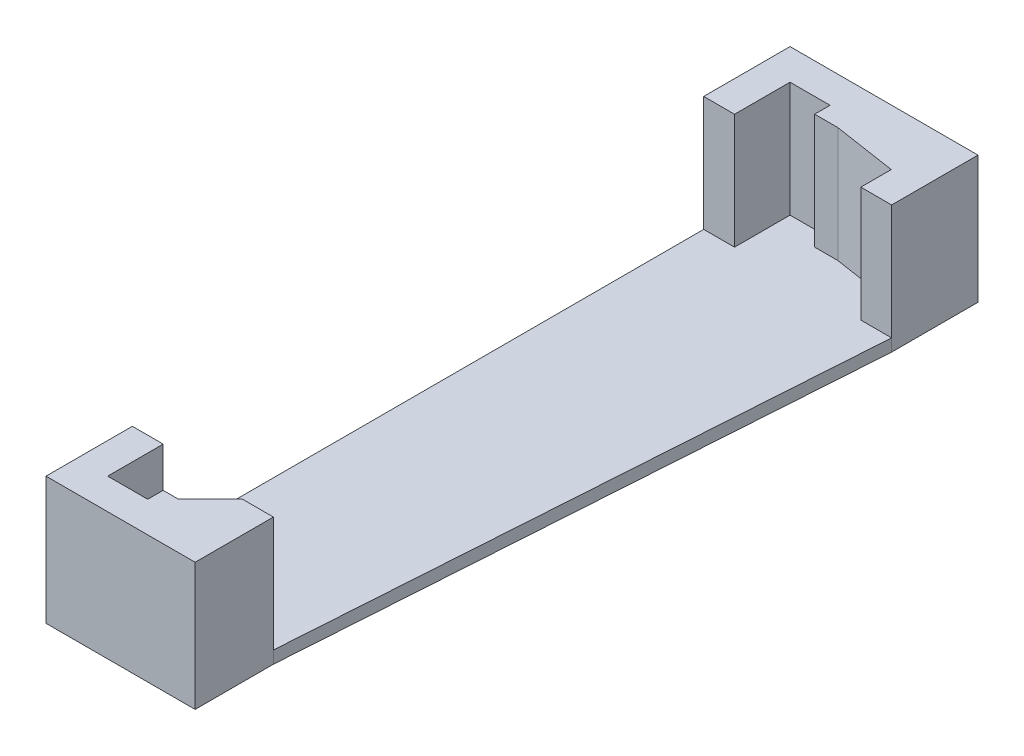
ISO-10303-21;
HEADER;
FILE_DESCRIPTION(('STEP AP214'),'2;1');
FILE_NAME('part.step','',(''),(''),'','','');
FILE_SCHEMA(('AUTOMOTIVE_DESIGN { 1 0 10303 214 1 1 1 1 }'));
ENDSEC;
DATA;
#1=APPLICATION_CONTEXT('core data for automotive mechanical design processes');
#2=APPLICATION_PROTOCOL_DEFINITION('international standard','automotive_design',2000,#1);
#3=PRODUCT_CONTEXT('',#1,'mechanical');
#4=PRODUCT('Part','Part','',(#3));
#5=PRODUCT_RELATED_PRODUCT_CATEGORY('part','',(#4));
#6=PRODUCT_DEFINITION_FORMATION('','',#4);
#7=PRODUCT_DEFINITION_CONTEXT('part definition',#1,'design');
#8=PRODUCT_DEFINITION('design','',#6,#7);
#9=PRODUCT_DEFINITION_SHAPE('','',#8);
#10=(LENGTH_UNIT() NAMED_UNIT(*) SI_UNIT(.MILLI.,.METRE.));
#11=(NAMED_UNIT(*) PLANE_ANGLE_UNIT() SI_UNIT($,.RADIAN.));
#12=(NAMED_UNIT(*) SI_UNIT($,.STERADIAN.) SOLID_ANGLE_UNIT());
#13=UNCERTAINTY_MEASURE_WITH_UNIT(LENGTH_MEASURE(1.E-05),#10,'distance_accuracy_value','');
#14=(GEOMETRIC_REPRESENTATION_CONTEXT(3) GLOBAL_UNCERTAINTY_ASSIGNED_CONTEXT((#13)) GLOBAL_UNIT_ASSIGNED_CONTEXT((#10,
#11,#12)) REPRESENTATION_CONTEXT('',''));
#15=CARTESIAN_POINT('',(0.,0.,0.));
#16=DIRECTION('',(0.,0.,1.));
#17=DIRECTION('',(1.,0.,0.));
#18=AXIS2_PLACEMENT_3D('',#15,#16,#17);
#19=CARTESIAN_POINT('',(0.,2.54,0.));
#20=DIRECTION('',(1.,0.,0.));
#21=DIRECTION('',(0.,0.,-1.));
#22=AXIS2_PLACEMENT_3D('',#19,#20,#21);
#23=PLANE('',#22);
#24=DIRECTION('',(0.,0.,1.));
#25=VECTOR('',#24,1.);
#26=CARTESIAN_POINT('',(0.,0.,0.));
#27=LINE('',#26,#25);
#28=CARTESIAN_POINT('',(0.,0.,-153.19375));
#29=VERTEX_POINT('',#28);
#30=CARTESIAN_POINT('',(0.,0.,0.));
#31=VERTEX_POINT('',#30);
#32=EDGE_CURVE('E211',#29,#31,#27,.T.);
#33=ORIENTED_EDGE('',*,*,#32,.T.);
#34=DIRECTION('',(0.,-1.,0.));
#35=VECTOR('',#34,1.);
#36=CARTESIAN_POINT('',(0.,2.54,0.));
#37=LINE('',#36,#35);
#38=CARTESIAN_POINT('',(0.,26.246666582,0.));
#39=VERTEX_POINT('',#38);
#40=EDGE_CURVE('E11',#39,#31,#37,.T.);
#41=ORIENTED_EDGE('',*,*,#40,.F.);
#42=DIRECTION('',(0.,0.,1.));
#43=VECTOR('',#42,1.);
#44=CARTESIAN_POINT('',(0.,26.246666582,0.));
#45=LINE('',#44,#43);
#46=CARTESIAN_POINT('',(0.,26.246666582,-17.78));
#47=VERTEX_POINT('',#46);
#48=EDGE_CURVE('E316',#47,#39,#45,.T.);
#49=ORIENTED_EDGE('',*,*,#48,.F.);
#50=DIRECTION('',(0.,-1.,0.));
#51=VECTOR('',#50,1.);
#52=CARTESIAN_POINT('',(0.,26.246666582,-17.78));
#53=LINE('',#52,#51);
#54=CARTESIAN_POINT('',(0.,2.54,-17.78));
#55=VERTEX_POINT('',#54);
#56=EDGE_CURVE('E197',#47,#55,#53,.T.);
#57=ORIENTED_EDGE('',*,*,#56,.T.);
#58=DIRECTION('',(0.,0.,1.));
#59=VECTOR('',#58,1.);
#60=CARTESIAN_POINT('',(0.,2.54,0.));
#61=LINE('',#60,#59);
#62=CARTESIAN_POINT('',(0.,2.54,-135.41375));
#63=VERTEX_POINT('',#62);
#64=EDGE_CURVE('E220',#63,#55,#61,.T.);
#65=ORIENTED_EDGE('',*,*,#64,.F.);
#66=DIRECTION('',(0.,-1.,0.));
#67=VECTOR('',#66,1.);
#68=CARTESIAN_POINT('',(0.,26.246666582,-135.41375));
#69=LINE('',#68,#67);
#70=CARTESIAN_POINT('',(0.,26.246666582,-135.41375));
#71=VERTEX_POINT('',#70);
#72=EDGE_CURVE('E244',#71,#63,#69,.T.);
#73=ORIENTED_EDGE('',*,*,#72,.F.);
#74=DIRECTION('',(0.,0.,1.));
#75=VECTOR('',#74,1.);
#76=CARTESIAN_POINT('',(0.,26.246666582,0.));
#77=LINE('',#76,#75);
#78=CARTESIAN_POINT('',(0.,26.246666582,-153.19375));
#79=VERTEX_POINT('',#78);
#80=EDGE_CURVE('E238',#79,#71,#77,.T.);
#81=ORIENTED_EDGE('',*,*,#80,.F.);
#82=DIRECTION('',(0.,-1.,0.));
#83=VECTOR('',#82,1.);
#84=CARTESIAN_POINT('',(0.,2.54,-153.19375));
#85=LINE('',#84,#83);
#86=EDGE_CURVE('E221',#79,#29,#85,.T.);
#87=ORIENTED_EDGE('',*,*,#86,.T.);
#88=EDGE_LOOP('',(#33,#41,#49,#57,#65,#73,#81,#87));
#89=FACE_BOUND('',#88,.T.);
#90=ADVANCED_FACE('F37',(#89),#23,.F.);
#91=CARTESIAN_POINT('',(0.,2.54,0.));
#92=DIRECTION('',(0.,0.,-1.));
#93=DIRECTION('',(-1.,0.,0.));
#94=AXIS2_PLACEMENT_3D('',#91,#92,#93);
#95=PLANE('',#94);
#96=DIRECTION('',(1.,0.,0.));
#97=VECTOR('',#96,1.);
#98=CARTESIAN_POINT('',(0.,0.,0.));
#99=LINE('',#98,#97);
#100=CARTESIAN_POINT('',(30.7032396375171,0.,0.));
#101=VERTEX_POINT('',#100);
#102=EDGE_CURVE('E203',#31,#101,#99,.T.);
#103=ORIENTED_EDGE('',*,*,#102,.T.);
#104=DIRECTION('',(0.,-1.,0.));
#105=VECTOR('',#104,1.);
#106=CARTESIAN_POINT('',(30.7032396375171,26.246666582,0.));
#107=LINE('',#106,#105);
#108=CARTESIAN_POINT('',(30.7032396375171,26.246666582,0.));
#109=VERTEX_POINT('',#108);
#110=EDGE_CURVE('E186',#109,#101,#107,.T.);
#111=ORIENTED_EDGE('',*,*,#110,.F.);
#112=DIRECTION('',(1.,0.,0.));
#113=VECTOR('',#112,1.);
#114=CARTESIAN_POINT('',(0.,26.246666582,0.));
#115=LINE('',#114,#113);
#116=EDGE_CURVE('E318',#39,#109,#115,.T.);
#117=ORIENTED_EDGE('',*,*,#116,.F.);
#118=ORIENTED_EDGE('',*,*,#40,.T.);
#119=EDGE_LOOP('',(#103,#111,#117,#118));
#120=FACE_BOUND('',#119,.T.);
#121=ADVANCED_FACE('F208',(#120),#95,.F.);
#122=CARTESIAN_POINT('',(38.699948,2.54,0.));
#123=DIRECTION('',(-1.,0.,0.));
#124=DIRECTION('',(0.,0.,1.));
#125=AXIS2_PLACEMENT_3D('',#122,#123,#124);
#126=PLANE('',#125);
#127=DIRECTION('',(0.,-1.,0.));
#128=VECTOR('',#127,1.);
#129=CARTESIAN_POINT('',(38.699948,26.246666582,-135.41375));
#130=LINE('',#129,#128);
#131=CARTESIAN_POINT('',(38.699948,26.246666582,-135.41375));
#132=VERTEX_POINT('',#131);
#133=CARTESIAN_POINT('',(38.699948,2.54,-135.41375));
#134=VERTEX_POINT('',#133);
#135=EDGE_CURVE('E273',#132,#134,#130,.T.);
#136=ORIENTED_EDGE('',*,*,#135,.T.);
#137=DIRECTION('',(0.,1.,0.));
#138=VECTOR('',#137,1.);
#139=CARTESIAN_POINT('',(38.699948,0.,-135.41375));
#140=LINE('',#139,#138);
#141=CARTESIAN_POINT('',(38.699948,0.,-135.41375));
#142=VERTEX_POINT('',#141);
#143=EDGE_CURVE('E390',#142,#134,#140,.T.);
#144=ORIENTED_EDGE('',*,*,#143,.F.);
#145=DIRECTION('',(0.,0.,-1.));
#146=VECTOR('',#145,1.);
#147=CARTESIAN_POINT('',(38.699948,0.,0.));
#148=LINE('',#147,#146);
#149=CARTESIAN_POINT('',(38.699948,0.,-153.19375));
#150=VERTEX_POINT('',#149);
#151=EDGE_CURVE('E210',#142,#150,#148,.T.);
#152=ORIENTED_EDGE('',*,*,#151,.T.);
#153=DIRECTION('',(0.,-1.,0.));
#154=VECTOR('',#153,1.);
#155=CARTESIAN_POINT('',(38.699948,2.54,-153.19375));
#156=LINE('',#155,#154);
#157=CARTESIAN_POINT('',(38.699948,26.246666582,-153.19375));
#158=VERTEX_POINT('',#157);
#159=EDGE_CURVE('E44',#158,#150,#156,.T.);
#160=ORIENTED_EDGE('',*,*,#159,.F.);
#161=DIRECTION('',(0.,0.,-1.));
#162=VECTOR('',#161,1.);
#163=CARTESIAN_POINT('',(38.699948,26.246666582,0.));
#164=LINE('',#163,#162);
#165=EDGE_CURVE('E242',#132,#158,#164,.T.);
#166=ORIENTED_EDGE('',*,*,#165,.F.);
#167=EDGE_LOOP('',(#136,#144,#152,#160,#166));
#168=FACE_BOUND('',#167,.T.);
#169=ADVANCED_FACE('F418',(#168),#126,.F.);
#170=CARTESIAN_POINT('',(0.,2.54,-153.19375));
#171=DIRECTION('',(0.,0.,1.));
#172=DIRECTION('',(1.,0.,0.));
#173=AXIS2_PLACEMENT_3D('',#170,#171,#172);
#174=PLANE('',#173);
#175=DIRECTION('',(-1.,0.,0.));
#176=VECTOR('',#175,1.);
#177=CARTESIAN_POINT('',(0.,0.,-153.19375));
#178=LINE('',#177,#176);
#179=EDGE_CURVE('E213',#150,#29,#178,.T.);
#180=ORIENTED_EDGE('',*,*,#179,.T.);
#181=ORIENTED_EDGE('',*,*,#86,.F.);
#182=DIRECTION('',(-1.,0.,0.));
#183=VECTOR('',#182,1.);
#184=CARTESIAN_POINT('',(0.,26.246666582,-153.19375));
#185=LINE('',#184,#183);
#186=EDGE_CURVE('E229',#158,#79,#185,.T.);
#187=ORIENTED_EDGE('',*,*,#186,.F.);
#188=ORIENTED_EDGE('',*,*,#159,.T.);
#189=EDGE_LOOP('',(#180,#181,#187,#188));
#190=FACE_BOUND('',#189,.T.);
#191=ADVANCED_FACE('F227',(#190),#174,.F.);
#192=CARTESIAN_POINT('',(0.,2.54,0.));
#193=DIRECTION('',(0.,-1.,0.));
#194=DIRECTION('',(0.,0.,-1.));
#195=AXIS2_PLACEMENT_3D('',#192,#193,#194);
#196=PLANE('',#195);
#197=DIRECTION('',(1.,0.,0.));
#198=VECTOR('',#197,1.);
#199=CARTESIAN_POINT('',(0.,2.54,-16.1157396375171));
#200=LINE('',#199,#198);
#201=CARTESIAN_POINT('',(24.3532396375171,2.54,-16.1157396375171));
#202=VERTEX_POINT('',#201);
#203=CARTESIAN_POINT('',(30.7032396375171,2.54,-16.1157396375171));
#204=VERTEX_POINT('',#203);
#205=EDGE_CURVE('E295',#202,#204,#200,.T.);
#206=ORIENTED_EDGE('',*,*,#205,.T.);
#207=DIRECTION('',(-0.0668812768469019,0.,0.997760940710413));
#208=VECTOR('',#207,1.);
#209=CARTESIAN_POINT('',(38.699948,2.54,-135.41375));
#210=LINE('',#209,#208);
#211=EDGE_CURVE('E206',#134,#204,#210,.T.);
#212=ORIENTED_EDGE('',*,*,#211,.F.);
#213=DIRECTION('',(1.,0.,0.));
#214=VECTOR('',#213,1.);
#215=CARTESIAN_POINT('',(0.,2.54,-135.41375));
#216=LINE('',#215,#214);
#217=CARTESIAN_POINT('',(32.35,2.54,-135.41375));
#218=VERTEX_POINT('',#217);
#219=EDGE_CURVE('E267',#218,#134,#216,.T.);
#220=ORIENTED_EDGE('',*,*,#219,.F.);
#221=DIRECTION('',(0.,0.,1.));
#222=VECTOR('',#221,1.);
#223=CARTESIAN_POINT('',(32.35,2.54,0.));
#224=LINE('',#223,#222);
#225=CARTESIAN_POINT('',(32.35,2.54,-141.684375));
#226=VERTEX_POINT('',#225);
#227=EDGE_CURVE('E264',#226,#218,#224,.T.);
#228=ORIENTED_EDGE('',*,*,#227,.F.);
#229=DIRECTION('',(0.988549583608947,0.,0.150896390767232));
#230=VECTOR('',#229,1.);
#231=CARTESIAN_POINT('',(21.8714552631246,2.54,-143.283864400941));
#232=LINE('',#231,#230);
#233=CARTESIAN_POINT('',(19.3499999999998,2.54,-143.66875));
#234=VERTEX_POINT('',#233);
#235=EDGE_CURVE('E261',#234,#226,#232,.T.);
#236=ORIENTED_EDGE('',*,*,#235,.F.);
#237=DIRECTION('',(1.,0.,0.));
#238=VECTOR('',#237,1.);
#239=CARTESIAN_POINT('',(0.,2.54,-143.66875));
#240=LINE('',#239,#238);
#241=CARTESIAN_POINT('',(14.5875,2.54,-143.66875));
#242=VERTEX_POINT('',#241);
#243=EDGE_CURVE('E258',#242,#234,#240,.T.);
#244=ORIENTED_EDGE('',*,*,#243,.F.);
#245=DIRECTION('',(0.,0.,1.));
#246=VECTOR('',#245,1.);
#247=CARTESIAN_POINT('',(14.5875,2.54,0.));
#248=LINE('',#247,#246);
#249=CARTESIAN_POINT('',(14.5875,2.54,-146.84375));
#250=VERTEX_POINT('',#249);
#251=EDGE_CURVE('E255',#250,#242,#248,.T.);
#252=ORIENTED_EDGE('',*,*,#251,.F.);
#253=DIRECTION('',(-1.,0.,0.));
#254=VECTOR('',#253,1.);
#255=CARTESIAN_POINT('',(0.,2.54,-146.84375));
#256=LINE('',#255,#254);
#257=CARTESIAN_POINT('',(6.34999999999997,2.54,-146.84375));
#258=VERTEX_POINT('',#257);
#259=EDGE_CURVE('E56',#250,#258,#256,.T.);
#260=ORIENTED_EDGE('',*,*,#259,.T.);
#261=DIRECTION('',(0.,0.,1.));
#262=VECTOR('',#261,1.);
#263=CARTESIAN_POINT('',(6.35,2.54,0.));
#264=LINE('',#263,#262);
#265=CARTESIAN_POINT('',(6.34999999999997,2.54,-135.41375));
#266=VERTEX_POINT('',#265);
#267=EDGE_CURVE('E51',#258,#266,#264,.T.);
#268=ORIENTED_EDGE('',*,*,#267,.T.);
#269=DIRECTION('',(-1.,0.,0.));
#270=VECTOR('',#269,1.);
#271=CARTESIAN_POINT('',(0.,2.54,-135.41375));
#272=LINE('',#271,#270);
#273=EDGE_CURVE('E250',#266,#63,#272,.T.);
#274=ORIENTED_EDGE('',*,*,#273,.T.);
#275=ORIENTED_EDGE('',*,*,#64,.T.);
#276=DIRECTION('',(-1.,0.,0.));
#277=VECTOR('',#276,1.);
#278=CARTESIAN_POINT('',(0.,2.54,-17.78));
#279=LINE('',#278,#277);
#280=CARTESIAN_POINT('',(6.34999999999997,2.54,-17.78));
#281=VERTEX_POINT('',#280);
#282=EDGE_CURVE('E300',#281,#55,#279,.T.);
#283=ORIENTED_EDGE('',*,*,#282,.F.);
#284=DIRECTION('',(0.,0.,-1.));
#285=VECTOR('',#284,1.);
#286=CARTESIAN_POINT('',(6.34999999999997,2.54,0.));
#287=LINE('',#286,#285);
#288=CARTESIAN_POINT('',(6.34999999999997,2.54,-6.34999999999999));
#289=VERTEX_POINT('',#288);
#290=EDGE_CURVE('E335',#289,#281,#287,.T.);
#291=ORIENTED_EDGE('',*,*,#290,.F.);
#292=DIRECTION('',(1.,0.,0.));
#293=VECTOR('',#292,1.);
#294=CARTESIAN_POINT('',(0.,2.54,-6.34999999999999));
#295=LINE('',#294,#293);
#296=CARTESIAN_POINT('',(14.5875,2.54,-6.35));
#297=VERTEX_POINT('',#296);
#298=EDGE_CURVE('E332',#289,#297,#295,.T.);
#299=ORIENTED_EDGE('',*,*,#298,.T.);
#300=DIRECTION('',(0.,0.,-1.));
#301=VECTOR('',#300,1.);
#302=CARTESIAN_POINT('',(14.5875000000001,2.54,-1.5940333043031E-13));
#303=LINE('',#302,#301);
#304=CARTESIAN_POINT('',(14.5875,2.54,-9.52500000000001));
#305=VERTEX_POINT('',#304);
#306=EDGE_CURVE('E329',#297,#305,#303,.T.);
#307=ORIENTED_EDGE('',*,*,#306,.T.);
#308=DIRECTION('',(1.,0.,0.));
#309=VECTOR('',#308,1.);
#310=CARTESIAN_POINT('',(0.,2.54,-9.52500000000001));
#311=LINE('',#310,#309);
#312=CARTESIAN_POINT('',(17.7625,2.54,-9.52500000000001));
#313=VERTEX_POINT('',#312);
#314=EDGE_CURVE('E326',#305,#313,#311,.T.);
#315=ORIENTED_EDGE('',*,*,#314,.T.);
#316=DIRECTION('',(0.707106781186546,0.,-0.707106781186549));
#317=VECTOR('',#316,1.);
#318=CARTESIAN_POINT('',(4.11875000000001,2.54,4.11875));
#319=LINE('',#318,#317);
#320=EDGE_CURVE('E323',#313,#202,#319,.T.);
#321=ORIENTED_EDGE('',*,*,#320,.T.);
#322=EDGE_LOOP('',(#206,#212,#220,#228,#236,#244,#252,#260,#268,#274,#275,#283,#291,#299,#307,
#315,#321));
#323=FACE_BOUND('',#322,.T.);
#324=ADVANCED_FACE('F356',(#323),#196,.F.);
#325=CARTESIAN_POINT('',(0.,0.,0.));
#326=DIRECTION('',(0.,-1.,0.));
#327=DIRECTION('',(0.,0.,-1.));
#328=AXIS2_PLACEMENT_3D('',#325,#326,#327);
#329=PLANE('',#328);
#330=DIRECTION('',(0.,0.,1.));
#331=VECTOR('',#330,1.);
#332=CARTESIAN_POINT('',(30.7032396375171,0.,-16.1157396375171));
#333=LINE('',#332,#331);
#334=CARTESIAN_POINT('',(30.7032396375171,0.,-16.1157396375171));
#335=VERTEX_POINT('',#334);
#336=EDGE_CURVE('E190',#335,#101,#333,.T.);
#337=ORIENTED_EDGE('',*,*,#336,.T.);
#338=ORIENTED_EDGE('',*,*,#102,.F.);
#339=ORIENTED_EDGE('',*,*,#32,.F.);
#340=ORIENTED_EDGE('',*,*,#179,.F.);
#341=ORIENTED_EDGE('',*,*,#151,.F.);
#342=DIRECTION('',(-0.0668812768469019,0.,0.997760940710413));
#343=VECTOR('',#342,1.);
#344=CARTESIAN_POINT('',(38.699948,0.,-135.41375));
#345=LINE('',#344,#343);
#346=EDGE_CURVE('E205',#142,#335,#345,.T.);
#347=ORIENTED_EDGE('',*,*,#346,.T.);
#348=EDGE_LOOP('',(#337,#338,#339,#340,#341,#347));
#349=FACE_BOUND('',#348,.T.);
#350=ADVANCED_FACE('F201',(#349),#329,.T.);
#351=CARTESIAN_POINT('',(0.,26.246666582,-16.1157396375171));
#352=DIRECTION('',(0.,0.,-1.));
#353=DIRECTION('',(-1.,0.,0.));
#354=AXIS2_PLACEMENT_3D('',#351,#352,#353);
#355=PLANE('',#354);
#356=ORIENTED_EDGE('',*,*,#205,.F.);
#357=DIRECTION('',(0.,-1.,0.));
#358=VECTOR('',#357,1.);
#359=CARTESIAN_POINT('',(24.3532396375171,26.246666582,-16.1157396375171));
#360=LINE('',#359,#358);
#361=CARTESIAN_POINT('',(24.3532396375171,26.246666582,-16.1157396375171));
#362=VERTEX_POINT('',#361);
#363=EDGE_CURVE('E215',#362,#202,#360,.T.);
#364=ORIENTED_EDGE('',*,*,#363,.F.);
#365=DIRECTION('',(1.,0.,0.));
#366=VECTOR('',#365,1.);
#367=CARTESIAN_POINT('',(0.,26.246666582,-16.1157396375171));
#368=LINE('',#367,#366);
#369=CARTESIAN_POINT('',(30.7032396375171,26.246666582,-16.1157396375171));
#370=VERTEX_POINT('',#369);
#371=EDGE_CURVE('E296',#362,#370,#368,.T.);
#372=ORIENTED_EDGE('',*,*,#371,.T.);
#373=DIRECTION('',(0.,-1.,0.));
#374=VECTOR('',#373,1.);
#375=CARTESIAN_POINT('',(30.7032396375171,26.246666582,-16.1157396375171));
#376=LINE('',#375,#374);
#377=EDGE_CURVE('E198',#370,#204,#376,.T.);
#378=ORIENTED_EDGE('',*,*,#377,.T.);
#379=EDGE_LOOP('',(#356,#364,#372,#378));
#380=FACE_BOUND('',#379,.T.);
#381=ADVANCED_FACE('F388',(#380),#355,.T.);
#382=CARTESIAN_POINT('',(4.11875000000001,26.246666582,4.11875));
#383=DIRECTION('',(-0.707106781186549,0.,-0.707106781186546));
#384=DIRECTION('',(-0.707106781186546,0.,0.707106781186549));
#385=AXIS2_PLACEMENT_3D('',#382,#383,#384);
#386=PLANE('',#385);
#387=ORIENTED_EDGE('',*,*,#320,.F.);
#388=DIRECTION('',(0.,-1.,0.));
#389=VECTOR('',#388,1.);
#390=CARTESIAN_POINT('',(17.7625,26.246666582,-9.52500000000001));
#391=LINE('',#390,#389);
#392=CARTESIAN_POINT('',(17.7625,26.246666582,-9.52500000000001));
#393=VERTEX_POINT('',#392);
#394=EDGE_CURVE('E352',#393,#313,#391,.T.);
#395=ORIENTED_EDGE('',*,*,#394,.F.);
#396=DIRECTION('',(0.707106781186546,0.,-0.707106781186549));
#397=VECTOR('',#396,1.);
#398=CARTESIAN_POINT('',(4.11875000000001,26.246666582,4.11875));
#399=LINE('',#398,#397);
#400=EDGE_CURVE('E299',#393,#362,#399,.T.);
#401=ORIENTED_EDGE('',*,*,#400,.T.);
#402=ORIENTED_EDGE('',*,*,#363,.T.);
#403=EDGE_LOOP('',(#387,#395,#401,#402));
#404=FACE_BOUND('',#403,.T.);
#405=ADVANCED_FACE('F385',(#404),#386,.T.);
#406=CARTESIAN_POINT('',(0.,26.246666582,-9.52500000000001));
#407=DIRECTION('',(0.,0.,-1.));
#408=DIRECTION('',(-1.,0.,0.));
#409=AXIS2_PLACEMENT_3D('',#406,#407,#408);
#410=PLANE('',#409);
#411=ORIENTED_EDGE('',*,*,#314,.F.);
#412=DIRECTION('',(0.,-1.,0.));
#413=VECTOR('',#412,1.);
#414=CARTESIAN_POINT('',(14.5875,26.246666582,-9.52500000000001));
#415=LINE('',#414,#413);
#416=CARTESIAN_POINT('',(14.5875,26.246666582,-9.52500000000001));
#417=VERTEX_POINT('',#416);
#418=EDGE_CURVE('E350',#417,#305,#415,.T.);
#419=ORIENTED_EDGE('',*,*,#418,.F.);
#420=DIRECTION('',(1.,0.,0.));
#421=VECTOR('',#420,1.);
#422=CARTESIAN_POINT('',(0.,26.246666582,-9.52500000000001));
#423=LINE('',#422,#421);
#424=EDGE_CURVE('E303',#417,#393,#423,.T.);
#425=ORIENTED_EDGE('',*,*,#424,.T.);
#426=ORIENTED_EDGE('',*,*,#394,.T.);
#427=EDGE_LOOP('',(#411,#419,#425,#426));
#428=FACE_BOUND('',#427,.T.);
#429=ADVANCED_FACE('F381',(#428),#410,.T.);
#430=CARTESIAN_POINT('',(14.5875000000001,26.246666582,-1.5940333043031E-13));
#431=DIRECTION('',(-1.,0.,0.));
#432=DIRECTION('',(0.,0.,1.));
#433=AXIS2_PLACEMENT_3D('',#430,#431,#432);
#434=PLANE('',#433);
#435=ORIENTED_EDGE('',*,*,#306,.F.);
#436=DIRECTION('',(0.,-1.,0.));
#437=VECTOR('',#436,1.);
#438=CARTESIAN_POINT('',(14.5875,26.246666582,-6.35));
#439=LINE('',#438,#437);
#440=CARTESIAN_POINT('',(14.5875,26.246666582,-6.35));
#441=VERTEX_POINT('',#440);
#442=EDGE_CURVE('E348',#441,#297,#439,.T.);
#443=ORIENTED_EDGE('',*,*,#442,.F.);
#444=DIRECTION('',(0.,0.,-1.));
#445=VECTOR('',#444,1.);
#446=CARTESIAN_POINT('',(14.5875000000001,26.246666582,-1.5940333043031E-13));
#447=LINE('',#446,#445);
#448=EDGE_CURVE('E306',#441,#417,#447,.T.);
#449=ORIENTED_EDGE('',*,*,#448,.T.);
#450=ORIENTED_EDGE('',*,*,#418,.T.);
#451=EDGE_LOOP('',(#435,#443,#449,#450));
#452=FACE_BOUND('',#451,.T.);
#453=ADVANCED_FACE('F377',(#452),#434,.T.);
#454=CARTESIAN_POINT('',(0.,26.246666582,-6.34999999999999));
#455=DIRECTION('',(0.,0.,-1.));
#456=DIRECTION('',(-1.,0.,0.));
#457=AXIS2_PLACEMENT_3D('',#454,#455,#456);
#458=PLANE('',#457);
#459=ORIENTED_EDGE('',*,*,#298,.F.);
#460=DIRECTION('',(0.,-1.,0.));
#461=VECTOR('',#460,1.);
#462=CARTESIAN_POINT('',(6.34999999999997,26.246666582,-6.34999999999999));
#463=LINE('',#462,#461);
#464=CARTESIAN_POINT('',(6.34999999999997,26.246666582,-6.34999999999999));
#465=VERTEX_POINT('',#464);
#466=EDGE_CURVE('E346',#465,#289,#463,.T.);
#467=ORIENTED_EDGE('',*,*,#466,.F.);
#468=DIRECTION('',(1.,0.,0.));
#469=VECTOR('',#468,1.);
#470=CARTESIAN_POINT('',(0.,26.246666582,-6.34999999999999));
#471=LINE('',#470,#469);
#472=EDGE_CURVE('E309',#465,#441,#471,.T.);
#473=ORIENTED_EDGE('',*,*,#472,.T.);
#474=ORIENTED_EDGE('',*,*,#442,.T.);
#475=EDGE_LOOP('',(#459,#467,#473,#474));
#476=FACE_BOUND('',#475,.T.);
#477=ADVANCED_FACE('F375',(#476),#458,.T.);
#478=CARTESIAN_POINT('',(6.34999999999997,26.246666582,0.));
#479=DIRECTION('',(-1.,0.,0.));
#480=DIRECTION('',(0.,0.,1.));
#481=AXIS2_PLACEMENT_3D('',#478,#479,#480);
#482=PLANE('',#481);
#483=ORIENTED_EDGE('',*,*,#290,.T.);
#484=DIRECTION('',(0.,-1.,0.));
#485=VECTOR('',#484,1.);
#486=CARTESIAN_POINT('',(6.34999999999997,26.246666582,-17.78));
#487=LINE('',#486,#485);
#488=CARTESIAN_POINT('',(6.34999999999997,26.246666582,-17.78));
#489=VERTEX_POINT('',#488);
#490=EDGE_CURVE('E343',#489,#281,#487,.T.);
#491=ORIENTED_EDGE('',*,*,#490,.F.);
#492=DIRECTION('',(0.,0.,-1.));
#493=VECTOR('',#492,1.);
#494=CARTESIAN_POINT('',(6.34999999999997,26.246666582,0.));
#495=LINE('',#494,#493);
#496=EDGE_CURVE('E312',#465,#489,#495,.T.);
#497=ORIENTED_EDGE('',*,*,#496,.F.);
#498=ORIENTED_EDGE('',*,*,#466,.T.);
#499=EDGE_LOOP('',(#483,#491,#497,#498));
#500=FACE_BOUND('',#499,.T.);
#501=ADVANCED_FACE('F371',(#500),#482,.F.);
#502=CARTESIAN_POINT('',(0.,26.246666582,-17.78));
#503=DIRECTION('',(0.,0.,1.));
#504=DIRECTION('',(1.,0.,0.));
#505=AXIS2_PLACEMENT_3D('',#502,#503,#504);
#506=PLANE('',#505);
#507=ORIENTED_EDGE('',*,*,#282,.T.);
#508=ORIENTED_EDGE('',*,*,#56,.F.);
#509=DIRECTION('',(-1.,0.,0.));
#510=VECTOR('',#509,1.);
#511=CARTESIAN_POINT('',(0.,26.246666582,-17.78));
#512=LINE('',#511,#510);
#513=EDGE_CURVE('E314',#489,#47,#512,.T.);
#514=ORIENTED_EDGE('',*,*,#513,.F.);
#515=ORIENTED_EDGE('',*,*,#490,.T.);
#516=EDGE_LOOP('',(#507,#508,#514,#515));
#517=FACE_BOUND('',#516,.T.);
#518=ADVANCED_FACE('F361',(#517),#506,.F.);
#519=CARTESIAN_POINT('',(30.7032396375171,26.246666582,-1.25587903990613E-13));
#520=DIRECTION('',(1.,0.,0.));
#521=DIRECTION('',(0.,0.,-1.));
#522=AXIS2_PLACEMENT_3D('',#519,#520,#521);
#523=PLANE('',#522);
#524=ORIENTED_EDGE('',*,*,#110,.T.);
#525=ORIENTED_EDGE('',*,*,#336,.F.);
#526=DIRECTION('',(0.,1.,0.));
#527=VECTOR('',#526,1.);
#528=CARTESIAN_POINT('',(30.7032396375171,0.,-16.1157396375171));
#529=LINE('',#528,#527);
#530=EDGE_CURVE('E252',#335,#204,#529,.T.);
#531=ORIENTED_EDGE('',*,*,#530,.T.);
#532=ORIENTED_EDGE('',*,*,#377,.F.);
#533=DIRECTION('',(0.,0.,1.));
#534=VECTOR('',#533,1.);
#535=CARTESIAN_POINT('',(30.7032396375171,26.246666582,-1.25587903990613E-13));
#536=LINE('',#535,#534);
#537=EDGE_CURVE('E193',#370,#109,#536,.T.);
#538=ORIENTED_EDGE('',*,*,#537,.T.);
#539=EDGE_LOOP('',(#524,#525,#531,#532,#538));
#540=FACE_BOUND('',#539,.T.);
#541=ADVANCED_FACE('F188',(#540),#523,.T.);
#542=CARTESIAN_POINT('',(0.,26.246666582,0.));
#543=DIRECTION('',(0.,1.,0.));
#544=DIRECTION('',(0.,0.,1.));
#545=AXIS2_PLACEMENT_3D('',#542,#543,#544);
#546=PLANE('',#545);
#547=ORIENTED_EDGE('',*,*,#371,.F.);
#548=ORIENTED_EDGE('',*,*,#400,.F.);
#549=ORIENTED_EDGE('',*,*,#424,.F.);
#550=ORIENTED_EDGE('',*,*,#448,.F.);
#551=ORIENTED_EDGE('',*,*,#472,.F.);
#552=ORIENTED_EDGE('',*,*,#496,.T.);
#553=ORIENTED_EDGE('',*,*,#513,.T.);
#554=ORIENTED_EDGE('',*,*,#48,.T.);
#555=ORIENTED_EDGE('',*,*,#116,.T.);
#556=ORIENTED_EDGE('',*,*,#537,.F.);
#557=EDGE_LOOP('',(#547,#548,#549,#550,#551,#552,#553,#554,#555,#556));
#558=FACE_BOUND('',#557,.T.);
#559=ADVANCED_FACE('F366',(#558),#546,.T.);
#560=CARTESIAN_POINT('',(0.,26.246666582,-135.41375));
#561=DIRECTION('',(0.,0.,1.));
#562=DIRECTION('',(1.,0.,0.));
#563=AXIS2_PLACEMENT_3D('',#560,#561,#562);
#564=PLANE('',#563);
#565=ORIENTED_EDGE('',*,*,#273,.F.);
#566=DIRECTION('',(0.,-1.,0.));
#567=VECTOR('',#566,1.);
#568=CARTESIAN_POINT('',(6.34999999999997,26.246666582,-135.41375));
#569=LINE('',#568,#567);
#570=CARTESIAN_POINT('',(6.34999999999997,26.246666582,-135.41375));
#571=VERTEX_POINT('',#570);
#572=EDGE_CURVE('E293',#571,#266,#569,.T.);
#573=ORIENTED_EDGE('',*,*,#572,.F.);
#574=DIRECTION('',(-1.,0.,0.));
#575=VECTOR('',#574,1.);
#576=CARTESIAN_POINT('',(0.,26.246666582,-135.41375));
#577=LINE('',#576,#575);
#578=EDGE_CURVE('E270',#571,#71,#577,.T.);
#579=ORIENTED_EDGE('',*,*,#578,.T.);
#580=ORIENTED_EDGE('',*,*,#72,.T.);
#581=EDGE_LOOP('',(#565,#573,#579,#580));
#582=FACE_BOUND('',#581,.T.);
#583=ADVANCED_FACE('F535',(#582),#564,.T.);
#584=CARTESIAN_POINT('',(6.35,26.246666582,0.));
#585=DIRECTION('',(1.,0.,0.));
#586=DIRECTION('',(0.,0.,-1.));
#587=AXIS2_PLACEMENT_3D('',#584,#585,#586);
#588=PLANE('',#587);
#589=ORIENTED_EDGE('',*,*,#267,.F.);
#590=DIRECTION('',(0.,-1.,0.));
#591=VECTOR('',#590,1.);
#592=CARTESIAN_POINT('',(6.34999999999997,26.246666582,-146.84375));
#593=LINE('',#592,#591);
#594=CARTESIAN_POINT('',(6.34999999999997,26.246666582,-146.84375));
#595=VERTEX_POINT('',#594);
#596=EDGE_CURVE('E291',#595,#258,#593,.T.);
#597=ORIENTED_EDGE('',*,*,#596,.F.);
#598=DIRECTION('',(0.,0.,1.));
#599=VECTOR('',#598,1.);
#600=CARTESIAN_POINT('',(6.35,26.246666582,0.));
#601=LINE('',#600,#599);
#602=EDGE_CURVE('E398',#595,#571,#601,.T.);
#603=ORIENTED_EDGE('',*,*,#602,.T.);
#604=ORIENTED_EDGE('',*,*,#572,.T.);
#605=EDGE_LOOP('',(#589,#597,#603,#604));
#606=FACE_BOUND('',#605,.T.);
#607=ADVANCED_FACE('F531',(#606),#588,.T.);
#608=CARTESIAN_POINT('',(0.,26.246666582,-146.84375));
#609=DIRECTION('',(0.,0.,1.));
#610=DIRECTION('',(1.,0.,0.));
#611=AXIS2_PLACEMENT_3D('',#608,#609,#610);
#612=PLANE('',#611);
#613=ORIENTED_EDGE('',*,*,#259,.F.);
#614=DIRECTION('',(0.,-1.,0.));
#615=VECTOR('',#614,1.);
#616=CARTESIAN_POINT('',(14.5875,26.246666582,-146.84375));
#617=LINE('',#616,#615);
#618=CARTESIAN_POINT('',(14.5875,26.246666582,-146.84375));
#619=VERTEX_POINT('',#618);
#620=EDGE_CURVE('E288',#619,#250,#617,.T.);
#621=ORIENTED_EDGE('',*,*,#620,.F.);
#622=DIRECTION('',(-1.,0.,0.));
#623=VECTOR('',#622,1.);
#624=CARTESIAN_POINT('',(0.,26.246666582,-146.84375));
#625=LINE('',#624,#623);
#626=EDGE_CURVE('E401',#619,#595,#625,.T.);
#627=ORIENTED_EDGE('',*,*,#626,.T.);
#628=ORIENTED_EDGE('',*,*,#596,.T.);
#629=EDGE_LOOP('',(#613,#621,#627,#628));
#630=FACE_BOUND('',#629,.T.);
#631=ADVANCED_FACE('F527',(#630),#612,.T.);
#632=CARTESIAN_POINT('',(14.5875,26.246666582,0.));
#633=DIRECTION('',(1.,0.,0.));
#634=DIRECTION('',(0.,0.,-1.));
#635=AXIS2_PLACEMENT_3D('',#632,#633,#634);
#636=PLANE('',#635);
#637=ORIENTED_EDGE('',*,*,#251,.T.);
#638=DIRECTION('',(0.,-1.,0.));
#639=VECTOR('',#638,1.);
#640=CARTESIAN_POINT('',(14.5875,26.246666582,-143.66875));
#641=LINE('',#640,#639);
#642=CARTESIAN_POINT('',(14.5875,26.246666582,-143.66875));
#643=VERTEX_POINT('',#642);
#644=EDGE_CURVE('E285',#643,#242,#641,.T.);
#645=ORIENTED_EDGE('',*,*,#644,.F.);
#646=DIRECTION('',(0.,0.,1.));
#647=VECTOR('',#646,1.);
#648=CARTESIAN_POINT('',(14.5875,26.246666582,0.));
#649=LINE('',#648,#647);
#650=EDGE_CURVE('E404',#619,#643,#649,.T.);
#651=ORIENTED_EDGE('',*,*,#650,.F.);
#652=ORIENTED_EDGE('',*,*,#620,.T.);
#653=EDGE_LOOP('',(#637,#645,#651,#652));
#654=FACE_BOUND('',#653,.T.);
#655=ADVANCED_FACE('F523',(#654),#636,.F.);
#656=CARTESIAN_POINT('',(0.,26.246666582,-143.66875));
#657=DIRECTION('',(0.,0.,-1.));
#658=DIRECTION('',(-1.,0.,0.));
#659=AXIS2_PLACEMENT_3D('',#656,#657,#658);
#660=PLANE('',#659);
#661=ORIENTED_EDGE('',*,*,#243,.T.);
#662=DIRECTION('',(0.,-1.,0.));
#663=VECTOR('',#662,1.);
#664=CARTESIAN_POINT('',(19.3499999999998,26.246666582,-143.66875));
#665=LINE('',#664,#663);
#666=CARTESIAN_POINT('',(19.3499999999998,26.246666582,-143.66875));
#667=VERTEX_POINT('',#666);
#668=EDGE_CURVE('E282',#667,#234,#665,.T.);
#669=ORIENTED_EDGE('',*,*,#668,.F.);
#670=DIRECTION('',(1.,0.,0.));
#671=VECTOR('',#670,1.);
#672=CARTESIAN_POINT('',(0.,26.246666582,-143.66875));
#673=LINE('',#672,#671);
#674=EDGE_CURVE('E406',#643,#667,#673,.T.);
#675=ORIENTED_EDGE('',*,*,#674,.F.);
#676=ORIENTED_EDGE('',*,*,#644,.T.);
#677=EDGE_LOOP('',(#661,#669,#675,#676));
#678=FACE_BOUND('',#677,.T.);
#679=ADVANCED_FACE('F519',(#678),#660,.F.);
#680=CARTESIAN_POINT('',(21.8714552631246,26.246666582,-143.283864400941));
#681=DIRECTION('',(0.150896390767232,0.,-0.988549583608947));
#682=DIRECTION('',(-0.988549583608947,0.,-0.150896390767232));
#683=AXIS2_PLACEMENT_3D('',#680,#681,#682);
#684=PLANE('',#683);
#685=ORIENTED_EDGE('',*,*,#235,.T.);
#686=DIRECTION('',(0.,-1.,0.));
#687=VECTOR('',#686,1.);
#688=CARTESIAN_POINT('',(32.35,26.246666582,-141.684375));
#689=LINE('',#688,#687);
#690=CARTESIAN_POINT('',(32.35,26.246666582,-141.684375));
#691=VERTEX_POINT('',#690);
#692=EDGE_CURVE('E279',#691,#226,#689,.T.);
#693=ORIENTED_EDGE('',*,*,#692,.F.);
#694=DIRECTION('',(0.988549583608947,0.,0.150896390767232));
#695=VECTOR('',#694,1.);
#696=CARTESIAN_POINT('',(21.8714552631246,26.246666582,-143.283864400941));
#697=LINE('',#696,#695);
#698=EDGE_CURVE('E408',#667,#691,#697,.T.);
#699=ORIENTED_EDGE('',*,*,#698,.F.);
#700=ORIENTED_EDGE('',*,*,#668,.T.);
#701=EDGE_LOOP('',(#685,#693,#699,#700));
#702=FACE_BOUND('',#701,.T.);
#703=ADVANCED_FACE('F515',(#702),#684,.F.);
#704=CARTESIAN_POINT('',(32.35,26.246666582,0.));
#705=DIRECTION('',(1.,0.,0.));
#706=DIRECTION('',(0.,0.,-1.));
#707=AXIS2_PLACEMENT_3D('',#704,#705,#706);
#708=PLANE('',#707);
#709=ORIENTED_EDGE('',*,*,#227,.T.);
#710=DIRECTION('',(0.,-1.,0.));
#711=VECTOR('',#710,1.);
#712=CARTESIAN_POINT('',(32.35,26.246666582,-135.41375));
#713=LINE('',#712,#711);
#714=CARTESIAN_POINT('',(32.35,26.246666582,-135.41375));
#715=VERTEX_POINT('',#714);
#716=EDGE_CURVE('E276',#715,#218,#713,.T.);
#717=ORIENTED_EDGE('',*,*,#716,.F.);
#718=DIRECTION('',(0.,0.,1.));
#719=VECTOR('',#718,1.);
#720=CARTESIAN_POINT('',(32.35,26.246666582,0.));
#721=LINE('',#720,#719);
#722=EDGE_CURVE('E410',#691,#715,#721,.T.);
#723=ORIENTED_EDGE('',*,*,#722,.F.);
#724=ORIENTED_EDGE('',*,*,#692,.T.);
#725=EDGE_LOOP('',(#709,#717,#723,#724));
#726=FACE_BOUND('',#725,.T.);
#727=ADVANCED_FACE('F496',(#726),#708,.F.);
#728=CARTESIAN_POINT('',(0.,26.246666582,-135.41375));
#729=DIRECTION('',(0.,0.,-1.));
#730=DIRECTION('',(-1.,0.,0.));
#731=AXIS2_PLACEMENT_3D('',#728,#729,#730);
#732=PLANE('',#731);
#733=ORIENTED_EDGE('',*,*,#219,.T.);
#734=ORIENTED_EDGE('',*,*,#135,.F.);
#735=DIRECTION('',(1.,0.,0.));
#736=VECTOR('',#735,1.);
#737=CARTESIAN_POINT('',(0.,26.246666582,-135.41375));
#738=LINE('',#737,#736);
#739=EDGE_CURVE('E246',#715,#132,#738,.T.);
#740=ORIENTED_EDGE('',*,*,#739,.F.);
#741=ORIENTED_EDGE('',*,*,#716,.T.);
#742=EDGE_LOOP('',(#733,#734,#740,#741));
#743=FACE_BOUND('',#742,.T.);
#744=ADVANCED_FACE('F416',(#743),#732,.F.);
#745=CARTESIAN_POINT('',(0.,26.246666582,0.));
#746=DIRECTION('',(0.,1.,0.));
#747=DIRECTION('',(0.,0.,1.));
#748=AXIS2_PLACEMENT_3D('',#745,#746,#747);
#749=PLANE('',#748);
#750=ORIENTED_EDGE('',*,*,#578,.F.);
#751=ORIENTED_EDGE('',*,*,#602,.F.);
#752=ORIENTED_EDGE('',*,*,#626,.F.);
#753=ORIENTED_EDGE('',*,*,#650,.T.);
#754=ORIENTED_EDGE('',*,*,#674,.T.);
#755=ORIENTED_EDGE('',*,*,#698,.T.);
#756=ORIENTED_EDGE('',*,*,#722,.T.);
#757=ORIENTED_EDGE('',*,*,#739,.T.);
#758=ORIENTED_EDGE('',*,*,#165,.T.);
#759=ORIENTED_EDGE('',*,*,#186,.T.);
#760=ORIENTED_EDGE('',*,*,#80,.T.);
#761=EDGE_LOOP('',(#750,#751,#752,#753,#754,#755,#756,#757,#758,#759,#760));
#762=FACE_BOUND('',#761,.T.);
#763=ADVANCED_FACE('F241',(#762),#749,.T.);
#764=CARTESIAN_POINT('',(38.699948,0.,-135.41375));
#765=DIRECTION('',(-0.997760940710413,0.,-0.0668812768469019));
#766=DIRECTION('',(-0.0668812768469019,0.,0.997760940710413));
#767=AXIS2_PLACEMENT_3D('',#764,#765,#766);
#768=PLANE('',#767);
#769=ORIENTED_EDGE('',*,*,#211,.T.);
#770=ORIENTED_EDGE('',*,*,#530,.F.);
#771=ORIENTED_EDGE('',*,*,#346,.F.);
#772=ORIENTED_EDGE('',*,*,#143,.T.);
#773=EDGE_LOOP('',(#769,#770,#771,#772));
#774=FACE_BOUND('',#773,.T.);
#775=ADVANCED_FACE('F504',(#774),#768,.F.);
#776=CLOSED_SHELL('',(#90,#121,#169,#191,#324,#350,#381,#405,#429,#453,#477,#501,#518,#541,#559,
#583,#607,#631,#655,#679,#703,#727,#744,#763,#775));
#777=MANIFOLD_SOLID_BREP('B2',#776);
#778=ADVANCED_BREP_SHAPE_REPRESENTATION('',(#18,#777),#14);
#779=SHAPE_DEFINITION_REPRESENTATION(#9,#778);
ENDSEC;
END-ISO-10303-21;
